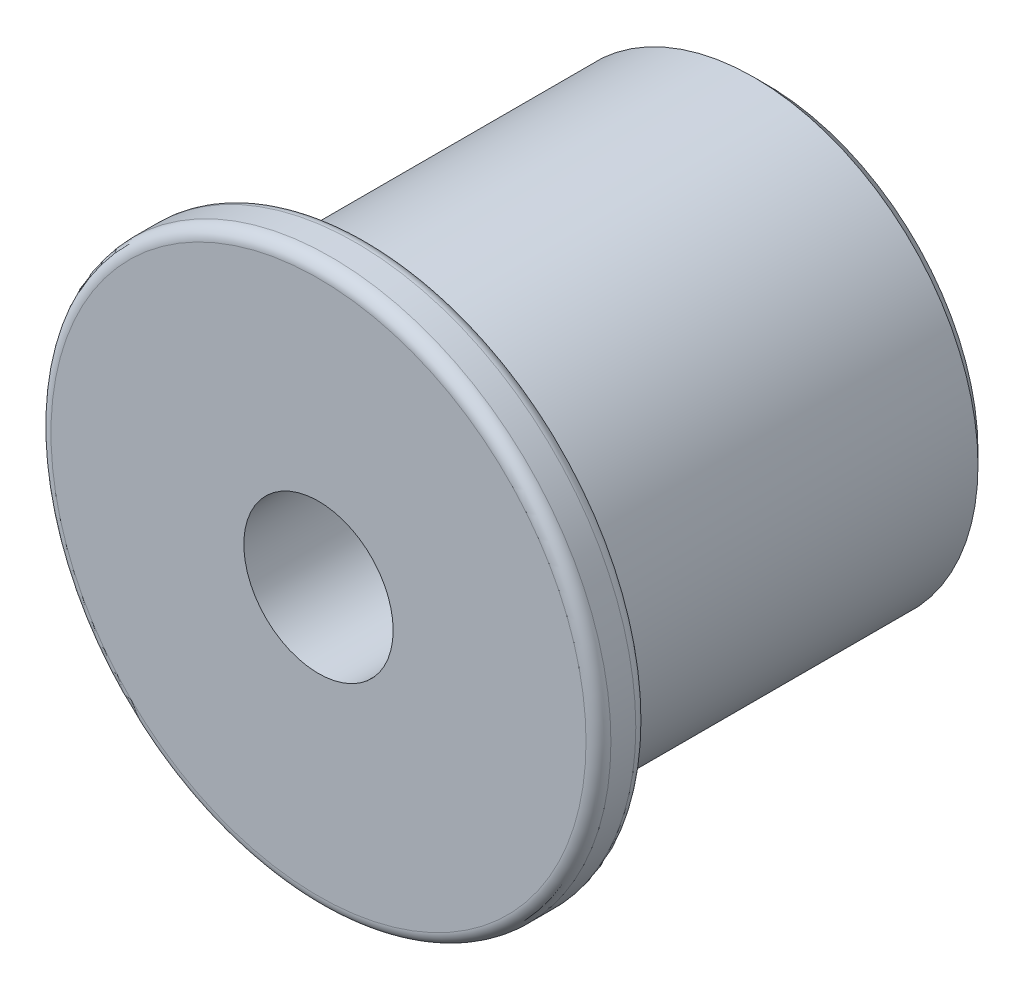
ISO-10303-21;
HEADER;
FILE_DESCRIPTION(('STEP AP214'),'2;1');
FILE_NAME('part.step','',(''),(''),'','','');
FILE_SCHEMA(('AUTOMOTIVE_DESIGN { 1 0 10303 214 1 1 1 1 }'));
ENDSEC;
DATA;
#1=APPLICATION_CONTEXT('core data for automotive mechanical design processes');
#2=APPLICATION_PROTOCOL_DEFINITION('international standard','automotive_design',2000,#1);
#3=PRODUCT_CONTEXT('',#1,'mechanical');
#4=PRODUCT('Part','Part','',(#3));
#5=PRODUCT_RELATED_PRODUCT_CATEGORY('part','',(#4));
#6=PRODUCT_DEFINITION_FORMATION('','',#4);
#7=PRODUCT_DEFINITION_CONTEXT('part definition',#1,'design');
#8=PRODUCT_DEFINITION('design','',#6,#7);
#9=PRODUCT_DEFINITION_SHAPE('','',#8);
#10=(LENGTH_UNIT() NAMED_UNIT(*) SI_UNIT(.MILLI.,.METRE.));
#11=(NAMED_UNIT(*) PLANE_ANGLE_UNIT() SI_UNIT($,.RADIAN.));
#12=(NAMED_UNIT(*) SI_UNIT($,.STERADIAN.) SOLID_ANGLE_UNIT());
#13=UNCERTAINTY_MEASURE_WITH_UNIT(LENGTH_MEASURE(1.E-05),#10,'distance_accuracy_value','');
#14=(GEOMETRIC_REPRESENTATION_CONTEXT(3) GLOBAL_UNCERTAINTY_ASSIGNED_CONTEXT((#13)) GLOBAL_UNIT_ASSIGNED_CONTEXT((#10,
#11,#12)) REPRESENTATION_CONTEXT('',''));
#15=CARTESIAN_POINT('',(0.,0.,0.));
#16=DIRECTION('',(0.,0.,1.));
#17=DIRECTION('',(1.,0.,0.));
#18=AXIS2_PLACEMENT_3D('',#15,#16,#17);
#19=CARTESIAN_POINT('',(0.,0.,-16.));
#20=DIRECTION('',(0.,0.,1.));
#21=DIRECTION('',(1.,0.,0.));
#22=AXIS2_PLACEMENT_3D('',#19,#20,#21);
#23=CYLINDRICAL_SURFACE('',#22,9.);
#24=CARTESIAN_POINT('',(0.,0.,-15.5));
#25=DIRECTION('',(0.,0.,1.));
#26=DIRECTION('',(1.,0.,0.));
#27=AXIS2_PLACEMENT_3D('',#24,#25,#26);
#28=CIRCLE('',#27,9.);
#29=CARTESIAN_POINT('',(9.,0.,-15.5));
#30=VERTEX_POINT('',#29);
#31=EDGE_CURVE('E54',#30,#30,#28,.T.);
#32=ORIENTED_EDGE('',*,*,#31,.T.);
#33=EDGE_LOOP('',(#32));
#34=FACE_BOUND('',#33,.T.);
#35=CARTESIAN_POINT('',(0.,0.,-0.8));
#36=DIRECTION('',(0.,0.,1.));
#37=DIRECTION('',(1.,0.,0.));
#38=AXIS2_PLACEMENT_3D('',#35,#36,#37);
#39=CIRCLE('',#38,9.);
#40=CARTESIAN_POINT('',(9.,0.,-0.8));
#41=VERTEX_POINT('',#40);
#42=EDGE_CURVE('E59',#41,#41,#39,.F.);
#43=ORIENTED_EDGE('',*,*,#42,.T.);
#44=EDGE_LOOP('',(#43));
#45=FACE_BOUND('',#44,.T.);
#46=ADVANCED_FACE('F45',(#34,#45),#23,.T.);
#47=CARTESIAN_POINT('',(0.,0.,-16.));
#48=DIRECTION('',(0.,0.,1.));
#49=DIRECTION('',(1.,0.,0.));
#50=AXIS2_PLACEMENT_3D('',#47,#48,#49);
#51=PLANE('',#50);
#52=CARTESIAN_POINT('',(0.,0.,-16.));
#53=DIRECTION('',(0.,0.,1.));
#54=DIRECTION('',(1.,0.,0.));
#55=AXIS2_PLACEMENT_3D('',#52,#53,#54);
#56=CIRCLE('',#55,8.49999999999999);
#57=CARTESIAN_POINT('',(8.49999999999999,0.,-16.));
#58=VERTEX_POINT('',#57);
#59=EDGE_CURVE('E10',#58,#58,#56,.F.);
#60=ORIENTED_EDGE('',*,*,#59,.T.);
#61=EDGE_LOOP('',(#60));
#62=FACE_BOUND('',#61,.T.);
#63=CARTESIAN_POINT('',(0.,0.,-16.));
#64=DIRECTION('',(0.,0.,1.));
#65=DIRECTION('',(1.,0.,0.));
#66=AXIS2_PLACEMENT_3D('',#63,#64,#65);
#67=CIRCLE('',#66,3.);
#68=CARTESIAN_POINT('',(3.,0.,-16.));
#69=VERTEX_POINT('',#68);
#70=EDGE_CURVE('E86',#69,#69,#67,.T.);
#71=ORIENTED_EDGE('',*,*,#70,.T.);
#72=EDGE_LOOP('',(#71));
#73=FACE_BOUND('',#72,.T.);
#74=ADVANCED_FACE('F110',(#62,#73),#51,.F.);
#75=CARTESIAN_POINT('',(0.,0.,-16.));
#76=DIRECTION('',(0.,0.,1.));
#77=DIRECTION('',(1.,0.,0.));
#78=AXIS2_PLACEMENT_3D('',#75,#76,#77);
#79=CYLINDRICAL_SURFACE('',#78,3.);
#80=ORIENTED_EDGE('',*,*,#70,.F.);
#81=EDGE_LOOP('',(#80));
#82=FACE_BOUND('',#81,.T.);
#83=CARTESIAN_POINT('',(0.,0.,2.));
#84=DIRECTION('',(0.,0.,1.));
#85=DIRECTION('',(1.,0.,0.));
#86=AXIS2_PLACEMENT_3D('',#83,#84,#85);
#87=CIRCLE('',#86,3.);
#88=CARTESIAN_POINT('',(3.,0.,2.));
#89=VERTEX_POINT('',#88);
#90=EDGE_CURVE('E90',#89,#89,#87,.T.);
#91=ORIENTED_EDGE('',*,*,#90,.T.);
#92=EDGE_LOOP('',(#91));
#93=FACE_BOUND('',#92,.T.);
#94=ADVANCED_FACE('F95',(#82,#93),#79,.F.);
#95=CARTESIAN_POINT('',(0.,0.,2.));
#96=DIRECTION('',(0.,0.,1.));
#97=DIRECTION('',(1.,0.,0.));
#98=AXIS2_PLACEMENT_3D('',#95,#96,#97);
#99=PLANE('',#98);
#100=CARTESIAN_POINT('',(0.,0.,2.));
#101=DIRECTION('',(0.,0.,1.));
#102=DIRECTION('',(1.,0.,0.));
#103=AXIS2_PLACEMENT_3D('',#100,#101,#102);
#104=CIRCLE('',#103,10.75);
#105=CARTESIAN_POINT('',(10.75,0.,2.));
#106=VERTEX_POINT('',#105);
#107=EDGE_CURVE('E82',#106,#106,#104,.T.);
#108=ORIENTED_EDGE('',*,*,#107,.T.);
#109=EDGE_LOOP('',(#108));
#110=FACE_BOUND('',#109,.T.);
#111=ORIENTED_EDGE('',*,*,#90,.F.);
#112=EDGE_LOOP('',(#111));
#113=FACE_BOUND('',#112,.T.);
#114=ADVANCED_FACE('F97',(#110,#113),#99,.T.);
#115=CARTESIAN_POINT('',(0.,0.,0.));
#116=DIRECTION('',(0.,0.,1.));
#117=DIRECTION('',(1.,0.,0.));
#118=AXIS2_PLACEMENT_3D('',#115,#116,#117);
#119=PLANE('',#118);
#120=CARTESIAN_POINT('',(0.,0.,0.));
#121=DIRECTION('',(0.,0.,1.));
#122=DIRECTION('',(1.,0.,0.));
#123=AXIS2_PLACEMENT_3D('',#120,#121,#122);
#124=CIRCLE('',#123,9.8);
#125=CARTESIAN_POINT('',(9.8,0.,0.));
#126=VERTEX_POINT('',#125);
#127=EDGE_CURVE('E64',#126,#126,#124,.T.);
#128=ORIENTED_EDGE('',*,*,#127,.T.);
#129=EDGE_LOOP('',(#128));
#130=FACE_BOUND('',#129,.T.);
#131=CARTESIAN_POINT('',(0.,0.,0.));
#132=DIRECTION('',(0.,0.,1.));
#133=DIRECTION('',(1.,0.,0.));
#134=AXIS2_PLACEMENT_3D('',#131,#132,#133);
#135=CIRCLE('',#134,10.75);
#136=CARTESIAN_POINT('',(10.75,0.,0.));
#137=VERTEX_POINT('',#136);
#138=EDGE_CURVE('E70',#137,#137,#135,.F.);
#139=ORIENTED_EDGE('',*,*,#138,.T.);
#140=EDGE_LOOP('',(#139));
#141=FACE_BOUND('',#140,.T.);
#142=ADVANCED_FACE('F99',(#130,#141),#119,.F.);
#143=CARTESIAN_POINT('',(0.,0.,2.));
#144=DIRECTION('',(0.,0.,-1.));
#145=DIRECTION('',(-1.,0.,0.));
#146=AXIS2_PLACEMENT_3D('',#143,#144,#145);
#147=CYLINDRICAL_SURFACE('',#146,11.25);
#148=CARTESIAN_POINT('',(0.,0.,0.5));
#149=DIRECTION('',(0.,0.,1.));
#150=DIRECTION('',(1.,0.,0.));
#151=AXIS2_PLACEMENT_3D('',#148,#149,#150);
#152=CIRCLE('',#151,11.25);
#153=CARTESIAN_POINT('',(11.25,0.,0.5));
#154=VERTEX_POINT('',#153);
#155=EDGE_CURVE('E74',#154,#154,#152,.T.);
#156=ORIENTED_EDGE('',*,*,#155,.T.);
#157=EDGE_LOOP('',(#156));
#158=FACE_BOUND('',#157,.T.);
#159=CARTESIAN_POINT('',(0.,0.,1.5));
#160=DIRECTION('',(0.,0.,1.));
#161=DIRECTION('',(1.,0.,0.));
#162=AXIS2_PLACEMENT_3D('',#159,#160,#161);
#163=CIRCLE('',#162,11.25);
#164=CARTESIAN_POINT('',(11.25,0.,1.5));
#165=VERTEX_POINT('',#164);
#166=EDGE_CURVE('E78',#165,#165,#163,.F.);
#167=ORIENTED_EDGE('',*,*,#166,.T.);
#168=EDGE_LOOP('',(#167));
#169=FACE_BOUND('',#168,.T.);
#170=ADVANCED_FACE('F107',(#158,#169),#147,.T.);
#171=CARTESIAN_POINT('',(0.,0.,1.5));
#172=DIRECTION('',(0.,0.,1.));
#173=DIRECTION('',(1.,0.,0.));
#174=AXIS2_PLACEMENT_3D('',#171,#172,#173);
#175=TOROIDAL_SURFACE('',#174,10.75,0.5);
#176=ORIENTED_EDGE('',*,*,#166,.F.);
#177=EDGE_LOOP('',(#176));
#178=FACE_BOUND('',#177,.T.);
#179=ORIENTED_EDGE('',*,*,#107,.F.);
#180=EDGE_LOOP('',(#179));
#181=FACE_BOUND('',#180,.T.);
#182=ADVANCED_FACE('F122',(#178,#181),#175,.T.);
#183=CARTESIAN_POINT('',(0.,0.,0.5));
#184=DIRECTION('',(0.,0.,1.));
#185=DIRECTION('',(1.,0.,0.));
#186=AXIS2_PLACEMENT_3D('',#183,#184,#185);
#187=TOROIDAL_SURFACE('',#186,10.75,0.5);
#188=ORIENTED_EDGE('',*,*,#138,.F.);
#189=EDGE_LOOP('',(#188));
#190=FACE_BOUND('',#189,.T.);
#191=ORIENTED_EDGE('',*,*,#155,.F.);
#192=EDGE_LOOP('',(#191));
#193=FACE_BOUND('',#192,.T.);
#194=ADVANCED_FACE('F124',(#190,#193),#187,.T.);
#195=CARTESIAN_POINT('',(0.,0.,-0.8));
#196=DIRECTION('',(0.,0.,1.));
#197=DIRECTION('',(1.,0.,0.));
#198=AXIS2_PLACEMENT_3D('',#195,#196,#197);
#199=TOROIDAL_SURFACE('',#198,9.8,0.8);
#200=ORIENTED_EDGE('',*,*,#42,.F.);
#201=EDGE_LOOP('',(#200));
#202=FACE_BOUND('',#201,.T.);
#203=ORIENTED_EDGE('',*,*,#127,.F.);
#204=EDGE_LOOP('',(#203));
#205=FACE_BOUND('',#204,.T.);
#206=ADVANCED_FACE('F127',(#202,#205),#199,.F.);
#207=CARTESIAN_POINT('',(0.,0.,-15.5));
#208=DIRECTION('',(0.,0.,1.));
#209=DIRECTION('',(1.,0.,0.));
#210=AXIS2_PLACEMENT_3D('',#207,#208,#209);
#211=CONICAL_SURFACE('',#210,9.,0.785398163397455);
#212=ORIENTED_EDGE('',*,*,#59,.F.);
#213=EDGE_LOOP('',(#212));
#214=FACE_BOUND('',#213,.T.);
#215=ORIENTED_EDGE('',*,*,#31,.F.);
#216=EDGE_LOOP('',(#215));
#217=FACE_BOUND('',#216,.T.);
#218=ADVANCED_FACE('F48',(#214,#217),#211,.T.);
#219=CLOSED_SHELL('',(#46,#74,#94,#114,#142,#170,#182,#194,#206,#218));
#220=MANIFOLD_SOLID_BREP('B2',#219);
#221=ADVANCED_BREP_SHAPE_REPRESENTATION('',(#18,#220),#14);
#222=SHAPE_DEFINITION_REPRESENTATION(#9,#221);
ENDSEC;
END-ISO-10303-21;
